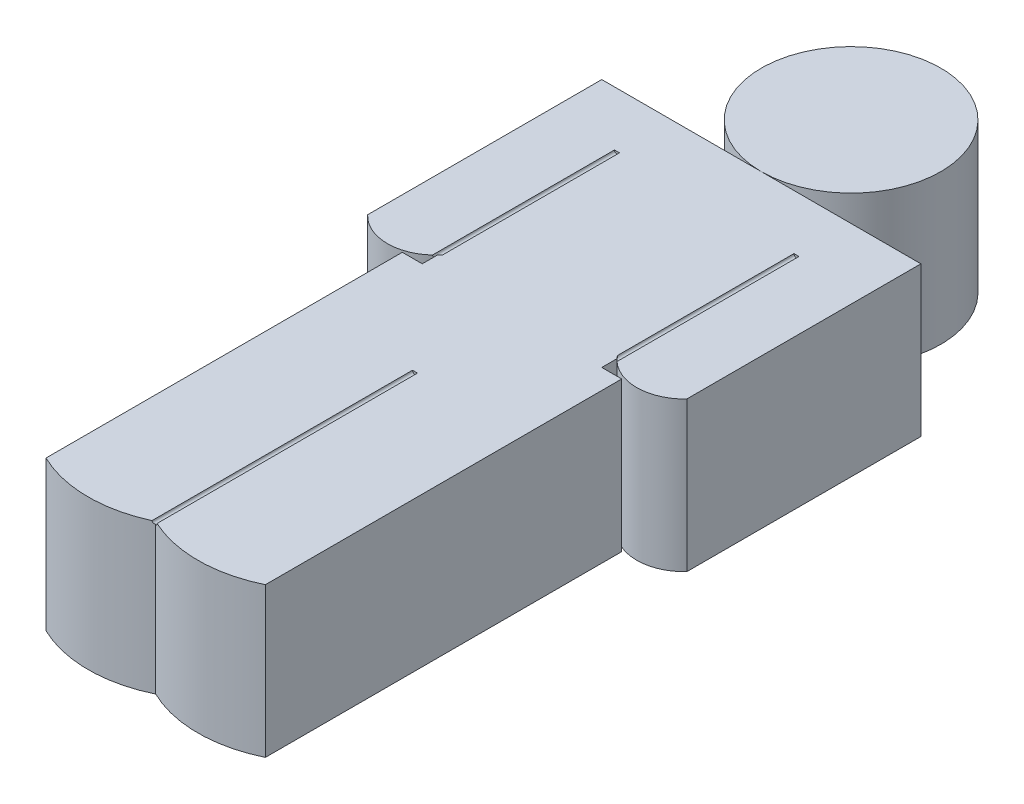
ISO-10303-21;
HEADER;
FILE_DESCRIPTION(('STEP AP214'),'2;1');
FILE_NAME('part.step','',(''),(''),'','','');
FILE_SCHEMA(('AUTOMOTIVE_DESIGN { 1 0 10303 214 1 1 1 1 }'));
ENDSEC;
DATA;
#1=APPLICATION_CONTEXT('core data for automotive mechanical design processes');
#2=APPLICATION_PROTOCOL_DEFINITION('international standard','automotive_design',2000,#1);
#3=PRODUCT_CONTEXT('',#1,'mechanical');
#4=PRODUCT('Part','Part','',(#3));
#5=PRODUCT_RELATED_PRODUCT_CATEGORY('part','',(#4));
#6=PRODUCT_DEFINITION_FORMATION('','',#4);
#7=PRODUCT_DEFINITION_CONTEXT('part definition',#1,'design');
#8=PRODUCT_DEFINITION('design','',#6,#7);
#9=PRODUCT_DEFINITION_SHAPE('','',#8);
#10=(LENGTH_UNIT() NAMED_UNIT(*) SI_UNIT(.MILLI.,.METRE.));
#11=(NAMED_UNIT(*) PLANE_ANGLE_UNIT() SI_UNIT($,.RADIAN.));
#12=(NAMED_UNIT(*) SI_UNIT($,.STERADIAN.) SOLID_ANGLE_UNIT());
#13=UNCERTAINTY_MEASURE_WITH_UNIT(LENGTH_MEASURE(1.E-05),#10,'distance_accuracy_value','');
#14=(GEOMETRIC_REPRESENTATION_CONTEXT(3) GLOBAL_UNCERTAINTY_ASSIGNED_CONTEXT((#13)) GLOBAL_UNIT_ASSIGNED_CONTEXT((#10,
#11,#12)) REPRESENTATION_CONTEXT('',''));
#15=CARTESIAN_POINT('',(0.,0.,0.));
#16=DIRECTION('',(0.,0.,1.));
#17=DIRECTION('',(1.,0.,0.));
#18=AXIS2_PLACEMENT_3D('',#15,#16,#17);
#19=CARTESIAN_POINT('',(0.,15.,-34.));
#20=DIRECTION('',(0.,-1.,0.));
#21=DIRECTION('',(0.,0.,-1.));
#22=AXIS2_PLACEMENT_3D('',#19,#20,#21);
#23=CYLINDRICAL_SURFACE('',#22,9.);
#24=CARTESIAN_POINT('',(0.,15.,-34.));
#25=DIRECTION('',(0.,1.,0.));
#26=DIRECTION('',(0.,0.,1.));
#27=AXIS2_PLACEMENT_3D('',#24,#25,#26);
#28=CIRCLE('',#27,9.);
#29=CARTESIAN_POINT('',(0.,15.,-25.));
#30=VERTEX_POINT('',#29);
#31=EDGE_CURVE('E12',#30,#30,#28,.T.);
#32=ORIENTED_EDGE('',*,*,#31,.F.);
#33=EDGE_LOOP('',(#32));
#34=FACE_BOUND('',#33,.T.);
#35=CARTESIAN_POINT('',(0.,0.,-34.));
#36=DIRECTION('',(0.,1.,0.));
#37=DIRECTION('',(0.,0.,1.));
#38=AXIS2_PLACEMENT_3D('',#35,#36,#37);
#39=CIRCLE('',#38,9.);
#40=CARTESIAN_POINT('',(0.,0.,-25.));
#41=VERTEX_POINT('',#40);
#42=EDGE_CURVE('E70',#41,#41,#39,.T.);
#43=ORIENTED_EDGE('',*,*,#42,.T.);
#44=EDGE_LOOP('',(#43));
#45=FACE_BOUND('',#44,.T.);
#46=ADVANCED_FACE('F67',(#34,#45),#23,.T.);
#47=CARTESIAN_POINT('',(0.,15.,0.));
#48=DIRECTION('',(0.,1.,0.));
#49=DIRECTION('',(0.,0.,1.));
#50=AXIS2_PLACEMENT_3D('',#47,#48,#49);
#51=PLANE('',#50);
#52=ORIENTED_EDGE('',*,*,#31,.T.);
#53=EDGE_LOOP('',(#52));
#54=FACE_BOUND('',#53,.T.);
#55=ADVANCED_FACE('F82',(#54),#51,.T.);
#56=CARTESIAN_POINT('',(0.,0.,0.));
#57=DIRECTION('',(0.,1.,0.));
#58=DIRECTION('',(0.,0.,1.));
#59=AXIS2_PLACEMENT_3D('',#56,#57,#58);
#60=PLANE('',#59);
#61=ORIENTED_EDGE('',*,*,#42,.F.);
#62=EDGE_LOOP('',(#61));
#63=FACE_BOUND('',#62,.T.);
#64=ADVANCED_FACE('F80',(#63),#60,.F.);
#65=CLOSED_SHELL('',(#46,#55,#64));
#66=MANIFOLD_SOLID_BREP('B2',#65);
#67=CARTESIAN_POINT('',(5.49999999999702,15.,24.4508474926195));
#68=DIRECTION('',(0.,-1.,0.));
#69=DIRECTION('',(0.,0.,-1.));
#70=AXIS2_PLACEMENT_3D('',#67,#68,#69);
#71=CYLINDRICAL_SURFACE('',#70,12.5491525073805);
#72=CARTESIAN_POINT('',(0.,14.75,35.7305296093073));
#73=CARTESIAN_POINT('',(0.0151917429758768,14.7499939525958,35.7379386432046));
#74=CARTESIAN_POINT('',(0.030408319613532,14.7513849473956,35.7453188273097));
#75=CARTESIAN_POINT('',(0.0604991903340054,14.7569486794015,35.7598408393742));
#76=CARTESIAN_POINT('',(0.0753722837928497,14.7611299841715,35.7669818618554));
#77=CARTESIAN_POINT('',(0.104311980644953,14.7722721522237,35.7808095200429));
#78=CARTESIAN_POINT('',(0.118377032446034,14.7792381712299,35.787495285848));
#79=CARTESIAN_POINT('',(0.145158683418947,14.7958513350814,35.8001700178912));
#80=CARTESIAN_POINT('',(0.157877064574848,14.8054948740658,35.8061599059977));
#81=CARTESIAN_POINT('',(0.180696752667213,14.8265801235266,35.8168666196132));
#82=CARTESIAN_POINT('',(0.190913274243636,14.8378678123865,35.8216402925644));
#83=CARTESIAN_POINT('',(0.209262562454438,14.8623667794742,35.8301896883421));
#84=CARTESIAN_POINT('',(0.217395751138456,14.8755776672412,35.8339656133012));
#85=CARTESIAN_POINT('',(0.230461146629122,14.9021014984492,35.8400193551582));
#86=CARTESIAN_POINT('',(0.235632487240922,14.9152714853539,35.8424093970391));
#87=CARTESIAN_POINT('',(0.243688748794359,14.9424219567888,35.8461290063904));
#88=CARTESIAN_POINT('',(0.246578559112484,14.9564006388364,35.8474608416633));
#89=CARTESIAN_POINT('',(0.248837921023468,14.9754207121644,35.8485018862791));
#90=CARTESIAN_POINT('',(0.249273701815418,14.9803281173357,35.848702644852));
#91=CARTESIAN_POINT('',(0.249854361094125,14.9901561723214,35.8489701254201));
#92=CARTESIAN_POINT('',(0.249999685992314,14.995076790154,35.8490370531047));
#93=CARTESIAN_POINT('',(0.250000000000001,15.,35.8490372021096));
#94=B_SPLINE_CURVE_WITH_KNOTS('',3,(#72,#73,#74,#75,#76,#77,#78,#79,#80,#81,#82,#83,#84,#85,#86,
#87,#88,#89,#90,#91,#92,#93),.UNSPECIFIED.,.F.,.F.,(4,2,2,2,2,2,2,2,2,2,4),(0.,
0.0506654136055286,0.101487114064062,0.152403346759942,0.203251339555192,0.250854477826768,
0.298447964829895,0.341270979800554,0.384001972974484,0.398786584367689,0.41354845526694),.UNSPECIFIED.);
#95=CARTESIAN_POINT('',(0.,14.75,35.7305296093073));
#96=VERTEX_POINT('',#95);
#97=CARTESIAN_POINT('',(0.249999999999999,15.,35.8490372021096));
#98=VERTEX_POINT('',#97);
#99=EDGE_CURVE('E245',#96,#98,#94,.T.);
#100=ORIENTED_EDGE('',*,*,#99,.F.);
#101=DIRECTION('',(0.,-1.,0.));
#102=VECTOR('',#101,1.);
#103=CARTESIAN_POINT('',(0.,15.,35.7305296093073));
#104=LINE('',#103,#102);
#105=CARTESIAN_POINT('',(0.,0.,35.7305296093073));
#106=VERTEX_POINT('',#105);
#107=EDGE_CURVE('E328',#96,#106,#104,.T.);
#108=ORIENTED_EDGE('',*,*,#107,.T.);
#109=CARTESIAN_POINT('',(5.49999999999702,0.,24.4508474926195));
#110=DIRECTION('',(0.,1.,0.));
#111=DIRECTION('',(0.,0.,1.));
#112=AXIS2_PLACEMENT_3D('',#109,#110,#111);
#113=CIRCLE('',#112,12.5491525073805);
#114=CARTESIAN_POINT('',(11.,0.,35.7305296093044));
#115=VERTEX_POINT('',#114);
#116=EDGE_CURVE('E377',#115,#106,#113,.F.);
#117=ORIENTED_EDGE('',*,*,#116,.F.);
#118=DIRECTION('',(0.,-1.,0.));
#119=VECTOR('',#118,1.);
#120=CARTESIAN_POINT('',(11.,15.,35.7305296093044));
#121=LINE('',#120,#119);
#122=CARTESIAN_POINT('',(11.,15.,35.7305296093044));
#123=VERTEX_POINT('',#122);
#124=EDGE_CURVE('E288',#123,#115,#121,.T.);
#125=ORIENTED_EDGE('',*,*,#124,.F.);
#126=CARTESIAN_POINT('',(5.49999999999702,15.,24.4508474926195));
#127=DIRECTION('',(0.,1.,0.));
#128=DIRECTION('',(0.,0.,1.));
#129=AXIS2_PLACEMENT_3D('',#126,#127,#128);
#130=CIRCLE('',#129,12.5491525073805);
#131=EDGE_CURVE('E336',#123,#98,#130,.F.);
#132=ORIENTED_EDGE('',*,*,#131,.T.);
#133=EDGE_LOOP('',(#100,#108,#117,#125,#132));
#134=FACE_BOUND('',#133,.T.);
#135=ADVANCED_FACE('F108',(#134),#71,.T.);
#136=CARTESIAN_POINT('',(11.,15.,0.));
#137=DIRECTION('',(-1.,0.,0.));
#138=DIRECTION('',(0.,0.,1.));
#139=AXIS2_PLACEMENT_3D('',#136,#137,#138);
#140=PLANE('',#139);
#141=DIRECTION('',(0.,0.,-1.));
#142=VECTOR('',#141,1.);
#143=CARTESIAN_POINT('',(11.,0.,0.));
#144=LINE('',#143,#142);
#145=CARTESIAN_POINT('',(11.,0.,0.));
#146=VERTEX_POINT('',#145);
#147=EDGE_CURVE('E373',#115,#146,#144,.T.);
#148=ORIENTED_EDGE('',*,*,#147,.T.);
#149=DIRECTION('',(0.,-1.,0.));
#150=VECTOR('',#149,1.);
#151=CARTESIAN_POINT('',(11.,15.,0.));
#152=LINE('',#151,#150);
#153=CARTESIAN_POINT('',(11.,15.,0.));
#154=VERTEX_POINT('',#153);
#155=EDGE_CURVE('E291',#154,#146,#152,.T.);
#156=ORIENTED_EDGE('',*,*,#155,.F.);
#157=DIRECTION('',(0.,0.,-1.));
#158=VECTOR('',#157,1.);
#159=CARTESIAN_POINT('',(11.,15.,0.));
#160=LINE('',#159,#158);
#161=EDGE_CURVE('E419',#123,#154,#160,.T.);
#162=ORIENTED_EDGE('',*,*,#161,.F.);
#163=ORIENTED_EDGE('',*,*,#124,.T.);
#164=EDGE_LOOP('',(#148,#156,#162,#163));
#165=FACE_BOUND('',#164,.T.);
#166=ADVANCED_FACE('F580',(#165),#140,.F.);
#167=CARTESIAN_POINT('',(0.,15.,0.));
#168=DIRECTION('',(0.,0.,-1.));
#169=DIRECTION('',(-1.,0.,0.));
#170=AXIS2_PLACEMENT_3D('',#167,#168,#169);
#171=PLANE('',#170);
#172=DIRECTION('',(1.,0.,0.));
#173=VECTOR('',#172,1.);
#174=CARTESIAN_POINT('',(0.,0.,0.));
#175=LINE('',#174,#173);
#176=CARTESIAN_POINT('',(9.,0.,0.));
#177=VERTEX_POINT('',#176);
#178=EDGE_CURVE('E369',#177,#146,#175,.T.);
#179=ORIENTED_EDGE('',*,*,#178,.F.);
#180=DIRECTION('',(0.,-1.,0.));
#181=VECTOR('',#180,1.);
#182=CARTESIAN_POINT('',(9.,15.,0.));
#183=LINE('',#182,#181);
#184=CARTESIAN_POINT('',(9.,15.,0.));
#185=VERTEX_POINT('',#184);
#186=EDGE_CURVE('E294',#185,#177,#183,.T.);
#187=ORIENTED_EDGE('',*,*,#186,.F.);
#188=DIRECTION('',(1.,0.,0.));
#189=VECTOR('',#188,1.);
#190=CARTESIAN_POINT('',(0.,15.,0.));
#191=LINE('',#190,#189);
#192=EDGE_CURVE('E415',#185,#154,#191,.T.);
#193=ORIENTED_EDGE('',*,*,#192,.T.);
#194=ORIENTED_EDGE('',*,*,#155,.T.);
#195=EDGE_LOOP('',(#179,#187,#193,#194));
#196=FACE_BOUND('',#195,.T.);
#197=ADVANCED_FACE('F536',(#196),#171,.T.);
#198=CARTESIAN_POINT('',(9.,15.,0.));
#199=DIRECTION('',(1.,0.,0.));
#200=DIRECTION('',(0.,0.,-1.));
#201=AXIS2_PLACEMENT_3D('',#198,#199,#200);
#202=PLANE('',#201);
#203=DIRECTION('',(0.,0.,1.));
#204=VECTOR('',#203,1.);
#205=CARTESIAN_POINT('',(9.,0.,0.));
#206=LINE('',#205,#204);
#207=CARTESIAN_POINT('',(9.,0.,-1.52426410276974));
#208=VERTEX_POINT('',#207);
#209=EDGE_CURVE('E365',#208,#177,#206,.T.);
#210=ORIENTED_EDGE('',*,*,#209,.F.);
#211=DIRECTION('',(0.,-1.,0.));
#212=VECTOR('',#211,1.);
#213=CARTESIAN_POINT('',(9.,15.,-1.52426410276974));
#214=LINE('',#213,#212);
#215=CARTESIAN_POINT('',(9.,14.75,-1.52426410276973));
#216=VERTEX_POINT('',#215);
#217=EDGE_CURVE('E300',#216,#208,#214,.T.);
#218=ORIENTED_EDGE('',*,*,#217,.F.);
#219=CARTESIAN_POINT('',(9.,15.,-1.52426410276974));
#220=VERTEX_POINT('',#219);
#221=EDGE_CURVE('E297',#220,#216,#214,.T.);
#222=ORIENTED_EDGE('',*,*,#221,.F.);
#223=DIRECTION('',(0.,0.,1.));
#224=VECTOR('',#223,1.);
#225=CARTESIAN_POINT('',(9.,15.,0.));
#226=LINE('',#225,#224);
#227=EDGE_CURVE('E411',#220,#185,#226,.T.);
#228=ORIENTED_EDGE('',*,*,#227,.T.);
#229=ORIENTED_EDGE('',*,*,#186,.T.);
#230=EDGE_LOOP('',(#210,#218,#222,#228,#229));
#231=FACE_BOUND('',#230,.T.);
#232=ADVANCED_FACE('F515',(#231),#202,.T.);
#233=CARTESIAN_POINT('',(12.5,15.,-4.79258417500001));
#234=DIRECTION('',(0.,-1.,0.));
#235=DIRECTION('',(0.,0.,-1.));
#236=AXIS2_PLACEMENT_3D('',#233,#234,#235);
#237=CYLINDRICAL_SURFACE('',#236,4.78872802469959);
#238=CARTESIAN_POINT('',(8.75,15.,-1.81442768237856));
#239=CARTESIAN_POINT('',(8.74999990332047,15.0104739874074,-1.81442780927218));
#240=CARTESIAN_POINT('',(8.75066482224969,15.0209474979495,-1.81358999016842));
#241=CARTESIAN_POINT('',(8.75324883459207,15.0414891966629,-1.81034074338826));
#242=CARTESIAN_POINT('',(8.7551693280895,15.0515569190212,-1.80792755903517));
#243=CARTESIAN_POINT('',(8.76005657513711,15.0708933967919,-1.8018059862385));
#244=CARTESIAN_POINT('',(8.76301306882711,15.0801689161113,-1.7981103021739));
#245=CARTESIAN_POINT('',(8.76977084851299,15.0979016661262,-1.78969626506693));
#246=CARTESIAN_POINT('',(8.77357251049626,15.1063585302179,-1.7849774568937));
#247=CARTESIAN_POINT('',(8.7841045892428,15.1268260147668,-1.77196508657687));
#248=CARTESIAN_POINT('',(8.79129959459044,15.1382504072605,-1.76312797781356));
#249=CARTESIAN_POINT('',(8.806799373211,15.1591980139258,-1.7442508483017));
#250=CARTESIAN_POINT('',(8.81510728301793,15.1687156577968,-1.73420743637821));
#251=CARTESIAN_POINT('',(8.8369921032231,15.1904573274968,-1.70799195343098));
#252=CARTESIAN_POINT('',(8.85108356998664,15.2015605217709,-1.69132163325249));
#253=CARTESIAN_POINT('',(8.88043821116125,15.2202444636492,-1.6571096879956));
#254=CARTESIAN_POINT('',(8.89570231715257,15.2278223762307,-1.63956737416631));
#255=CARTESIAN_POINT('',(8.92765910132049,15.2399374238356,-1.60339916007521));
#256=CARTESIAN_POINT('',(8.94438443051636,15.2443419920491,-1.5847578815977));
#257=CARTESIAN_POINT('',(8.97839743148258,15.2496593836323,-1.54745395154867));
#258=CARTESIAN_POINT('',(8.99568578771742,15.2505677838029,-1.52879130276376));
#259=CARTESIAN_POINT('',(9.03389947566316,15.2485681661792,-1.48819563966653));
#260=CARTESIAN_POINT('',(9.05487271594316,15.2448761861554,-1.46633959445014));
#261=CARTESIAN_POINT('',(9.09632795756342,15.2317141695525,-1.42393426668173));
#262=CARTESIAN_POINT('',(9.11681130843986,15.2222625361979,-1.40338105131828));
#263=CARTESIAN_POINT('',(9.14704936391844,15.2025793122635,-1.37353936022687));
#264=CARTESIAN_POINT('',(9.15745122668942,15.1946519777231,-1.36337463804434));
#265=CARTESIAN_POINT('',(9.17736525599253,15.176694119747,-1.34407657147858));
#266=CARTESIAN_POINT('',(9.18687876346094,15.1666668427936,-1.33494166815867));
#267=CARTESIAN_POINT('',(9.20280258673648,15.1466321800833,-1.31976081527466));
#268=CARTESIAN_POINT('',(9.20945484361373,15.1370111051606,-1.31346099915655));
#269=CARTESIAN_POINT('',(9.2215675552168,15.1164049415985,-1.3020446865614));
#270=CARTESIAN_POINT('',(9.22702932422192,15.1054213783685,-1.29692688478363));
#271=CARTESIAN_POINT('',(9.23563071252569,15.0841833517316,-1.28889495238291));
#272=CARTESIAN_POINT('',(9.2390051436535,15.0741096046897,-1.28575619762943));
#273=CARTESIAN_POINT('',(9.24448090694747,15.0533315156181,-1.28067221377321));
#274=CARTESIAN_POINT('',(9.24658296172704,15.0426275353108,-1.27872630721505));
#275=CARTESIAN_POINT('',(9.24937314887101,15.020835349177,-1.27614493212539));
#276=CARTESIAN_POINT('',(9.25005575314608,15.0097458115029,-1.27551458704993));
#277=CARTESIAN_POINT('',(9.24993710380035,14.9875815480756,-1.27562422631091));
#278=CARTESIAN_POINT('',(9.24913592828095,14.9765068215735,-1.27636413852141));
#279=CARTESIAN_POINT('',(9.2462096467683,14.955425356253,-1.27907198074358));
#280=CARTESIAN_POINT('',(9.24417216248223,14.9453955331904,-1.28095864992135));
#281=CARTESIAN_POINT('',(9.23897856421033,14.9258979194856,-1.28578110620704));
#282=CARTESIAN_POINT('',(9.23582228561131,14.9164302117894,-1.28871704769958));
#283=CARTESIAN_POINT('',(9.22829270774757,14.8975650102122,-1.29574621929804));
#284=CARTESIAN_POINT('',(9.22384808796584,14.8882217599051,-1.2999076093415));
#285=CARTESIAN_POINT('',(9.21407340139216,14.8704801476626,-1.3091020556399));
#286=CARTESIAN_POINT('',(9.2087427929695,14.862082369022,-1.31413564517639));
#287=CARTESIAN_POINT('',(9.19441886752458,14.8421364832497,-1.32773347301977));
#288=CARTESIAN_POINT('',(9.18496735005637,14.831235787386,-1.33676802426058));
#289=CARTESIAN_POINT('',(9.16501079709491,14.8116713674786,-1.35602238040718));
#290=CARTESIAN_POINT('',(9.15450333359509,14.8030129705757,-1.36624492578863));
#291=CARTESIAN_POINT('',(9.12879001200552,14.7849562295196,-1.39151198756653));
#292=CARTESIAN_POINT('',(9.11329652151448,14.7764919298026,-1.40693018853477));
#293=CARTESIAN_POINT('',(9.08179940561578,14.7631412814075,-1.43873187801351));
#294=CARTESIAN_POINT('',(9.06579524181478,14.7582588484461,-1.45511640184402));
#295=CARTESIAN_POINT('',(9.02940519688609,14.7508681836735,-1.49292570482442));
#296=CARTESIAN_POINT('',(9.00899662735778,14.7493494419057,-1.51452257167594));
#297=CARTESIAN_POINT('',(8.96865284940244,14.751150350974,-1.55802284135528));
#298=CARTESIAN_POINT('',(8.94871885176707,14.7544812584812,-1.5799268401006));
#299=CARTESIAN_POINT('',(8.90970855613067,14.7659801668951,-1.62357986388089));
#300=CARTESIAN_POINT('',(8.89064103619248,14.7741892316147,-1.64532596817208));
#301=CARTESIAN_POINT('',(8.85421608770099,14.7958083084484,-1.68759747948562));
#302=CARTESIAN_POINT('',(8.83685110459897,14.8091939073102,-1.70812810245218));
#303=CARTESIAN_POINT('',(8.81340657634525,14.8332741763335,-1.73626518310007));
#304=CARTESIAN_POINT('',(8.80622143648532,14.8416384745103,-1.74495704786589));
#305=CARTESIAN_POINT('',(8.79268742770785,14.8598219121645,-1.76143557170882));
#306=CARTESIAN_POINT('',(8.78633758801675,14.869639334119,-1.76922328032396));
#307=CARTESIAN_POINT('',(8.77586042213823,14.8888352707277,-1.78214289900115));
#308=CARTESIAN_POINT('',(8.77153943771584,14.8979546399358,-1.78749927765731));
#309=CARTESIAN_POINT('',(8.76388721909108,14.9171897153465,-1.79701834240602));
#310=CARTESIAN_POINT('',(8.76055512316242,14.9273045437996,-1.80118206767652));
#311=CARTESIAN_POINT('',(8.75532485400337,14.9476821040242,-1.8077322799188));
#312=CARTESIAN_POINT('',(8.75334699624328,14.9578916671088,-1.81021738435055));
#313=CARTESIAN_POINT('',(8.75068548004902,14.9787347064984,-1.81356394007555));
#314=CARTESIAN_POINT('',(8.75000009814176,14.9893675989488,-1.81442755356574));
#315=CARTESIAN_POINT('',(8.75,15.,-1.81442768237856));
#316=B_SPLINE_CURVE_WITH_KNOTS('',3,(#238,#239,#240,#241,#242,#243,#244,#245,#246,#247,#248,
#249,#250,#251,#252,#253,#254,#255,#256,#257,#258,#259,#260,#261,#262,#263,#264,#265,#266,#267,
#268,#269,#270,#271,#272,#273,#274,#275,#276,#277,#278,#279,#280,#281,#282,#283,#284,#285,#286,
#287,#288,#289,#290,#291,#292,#293,#294,#295,#296,#297,#298,#299,#300,#301,#302,#303,#304,#305,
#306,#307,#308,#309,#310,#311,#312,#313,#314,#315),.UNSPECIFIED.,.T.,.F.,(4,2,2,2,2,2,2,2,2,2,2,
2,2,2,2,2,2,2,2,2,2,2,2,2,2,2,2,2,2,2,2,2,2,2,2,2,2,2,4),(0.,0.0313705622509901,
0.0627761654447175,0.0938791507490141,0.12499600052868,0.173132471976601,0.221407580095592,
0.294478272332121,0.367607626682899,0.443638298321145,0.519765129082803,0.610831923771543,
0.701609256812368,0.751154073166558,0.800622851992999,0.840332689226262,0.87999846287285,
0.913092188663836,0.946167102047561,0.979370587180347,1.01257232463783,1.04365826359723,
1.074748778269,1.10808014204461,1.14143195771201,1.19221490935571,1.24311742414751,
1.31305466444043,1.38306824704651,1.47188091740702,1.56090006253748,1.65067939324778,
1.74004037656132,1.78206686558115,1.82404407219857,1.85819865871009,1.89232339462452,
1.92421097157077,1.9560559973552),.UNSPECIFIED.);
#317=CARTESIAN_POINT('',(9.25,15.,-1.27556610644487));
#318=VERTEX_POINT('',#317);
#319=EDGE_CURVE('E493',#318,#216,#316,.T.);
#320=ORIENTED_EDGE('',*,*,#319,.T.);
#321=ORIENTED_EDGE('',*,*,#217,.T.);
#322=CARTESIAN_POINT('',(12.5,0.,-4.79258417500001));
#323=DIRECTION('',(0.,1.,0.));
#324=DIRECTION('',(0.,0.,1.));
#325=AXIS2_PLACEMENT_3D('',#322,#323,#324);
#326=CIRCLE('',#325,4.78872802469959);
#327=CARTESIAN_POINT('',(16.,0.,-1.52426410276973));
#328=VERTEX_POINT('',#327);
#329=EDGE_CURVE('E361',#328,#208,#326,.F.);
#330=ORIENTED_EDGE('',*,*,#329,.F.);
#331=DIRECTION('',(0.,-1.,0.));
#332=VECTOR('',#331,1.);
#333=CARTESIAN_POINT('',(16.,15.,-1.52426410276973));
#334=LINE('',#333,#332);
#335=CARTESIAN_POINT('',(16.,15.,-1.52426410276973));
#336=VERTEX_POINT('',#335);
#337=EDGE_CURVE('E301',#336,#328,#334,.T.);
#338=ORIENTED_EDGE('',*,*,#337,.F.);
#339=CARTESIAN_POINT('',(12.5,15.,-4.79258417500001));
#340=DIRECTION('',(0.,1.,0.));
#341=DIRECTION('',(0.,0.,1.));
#342=AXIS2_PLACEMENT_3D('',#339,#340,#341);
#343=CIRCLE('',#342,4.78872802469959);
#344=EDGE_CURVE('E407',#336,#318,#343,.F.);
#345=ORIENTED_EDGE('',*,*,#344,.T.);
#346=EDGE_LOOP('',(#320,#321,#330,#338,#345));
#347=FACE_BOUND('',#346,.T.);
#348=ADVANCED_FACE('F512',(#347),#237,.T.);
#349=CARTESIAN_POINT('',(16.,15.,0.));
#350=DIRECTION('',(1.,0.,0.));
#351=DIRECTION('',(0.,0.,-1.));
#352=AXIS2_PLACEMENT_3D('',#349,#350,#351);
#353=PLANE('',#352);
#354=DIRECTION('',(0.,0.,1.));
#355=VECTOR('',#354,1.);
#356=CARTESIAN_POINT('',(16.,0.,0.));
#357=LINE('',#356,#355);
#358=CARTESIAN_POINT('',(16.,0.,-25.));
#359=VERTEX_POINT('',#358);
#360=EDGE_CURVE('E357',#359,#328,#357,.T.);
#361=ORIENTED_EDGE('',*,*,#360,.F.);
#362=DIRECTION('',(0.,-1.,0.));
#363=VECTOR('',#362,1.);
#364=CARTESIAN_POINT('',(16.,15.,-25.));
#365=LINE('',#364,#363);
#366=CARTESIAN_POINT('',(16.,15.,-25.));
#367=VERTEX_POINT('',#366);
#368=EDGE_CURVE('E304',#367,#359,#365,.T.);
#369=ORIENTED_EDGE('',*,*,#368,.F.);
#370=DIRECTION('',(0.,0.,1.));
#371=VECTOR('',#370,1.);
#372=CARTESIAN_POINT('',(16.,15.,0.));
#373=LINE('',#372,#371);
#374=EDGE_CURVE('E403',#367,#336,#373,.T.);
#375=ORIENTED_EDGE('',*,*,#374,.T.);
#376=ORIENTED_EDGE('',*,*,#337,.T.);
#377=EDGE_LOOP('',(#361,#369,#375,#376));
#378=FACE_BOUND('',#377,.T.);
#379=ADVANCED_FACE('F521',(#378),#353,.T.);
#380=CARTESIAN_POINT('',(0.,15.,-25.));
#381=DIRECTION('',(0.,0.,-1.));
#382=DIRECTION('',(-1.,0.,0.));
#383=AXIS2_PLACEMENT_3D('',#380,#381,#382);
#384=PLANE('',#383);
#385=DIRECTION('',(1.,0.,0.));
#386=VECTOR('',#385,1.);
#387=CARTESIAN_POINT('',(0.,0.,-25.));
#388=LINE('',#387,#386);
#389=CARTESIAN_POINT('',(-16.,0.,-25.));
#390=VERTEX_POINT('',#389);
#391=EDGE_CURVE('E353',#390,#359,#388,.T.);
#392=ORIENTED_EDGE('',*,*,#391,.F.);
#393=DIRECTION('',(0.,-1.,0.));
#394=VECTOR('',#393,1.);
#395=CARTESIAN_POINT('',(-16.,15.,-25.));
#396=LINE('',#395,#394);
#397=CARTESIAN_POINT('',(-16.,15.,-25.));
#398=VERTEX_POINT('',#397);
#399=EDGE_CURVE('E307',#398,#390,#396,.T.);
#400=ORIENTED_EDGE('',*,*,#399,.F.);
#401=DIRECTION('',(1.,0.,0.));
#402=VECTOR('',#401,1.);
#403=CARTESIAN_POINT('',(0.,15.,-25.));
#404=LINE('',#403,#402);
#405=EDGE_CURVE('E399',#398,#367,#404,.T.);
#406=ORIENTED_EDGE('',*,*,#405,.T.);
#407=ORIENTED_EDGE('',*,*,#368,.T.);
#408=EDGE_LOOP('',(#392,#400,#406,#407));
#409=FACE_BOUND('',#408,.T.);
#410=ADVANCED_FACE('F567',(#409),#384,.T.);
#411=CARTESIAN_POINT('',(-16.,15.,0.));
#412=DIRECTION('',(1.,0.,0.));
#413=DIRECTION('',(0.,0.,-1.));
#414=AXIS2_PLACEMENT_3D('',#411,#412,#413);
#415=PLANE('',#414);
#416=DIRECTION('',(0.,0.,1.));
#417=VECTOR('',#416,1.);
#418=CARTESIAN_POINT('',(-16.,0.,0.));
#419=LINE('',#418,#417);
#420=CARTESIAN_POINT('',(-16.,0.,-1.52426410276973));
#421=VERTEX_POINT('',#420);
#422=EDGE_CURVE('E350',#390,#421,#419,.T.);
#423=ORIENTED_EDGE('',*,*,#422,.T.);
#424=DIRECTION('',(0.,-1.,0.));
#425=VECTOR('',#424,1.);
#426=CARTESIAN_POINT('',(-16.,15.,-1.52426410276973));
#427=LINE('',#426,#425);
#428=CARTESIAN_POINT('',(-16.,15.,-1.52426410276973));
#429=VERTEX_POINT('',#428);
#430=EDGE_CURVE('E310',#429,#421,#427,.T.);
#431=ORIENTED_EDGE('',*,*,#430,.F.);
#432=DIRECTION('',(0.,0.,1.));
#433=VECTOR('',#432,1.);
#434=CARTESIAN_POINT('',(-16.,15.,0.));
#435=LINE('',#434,#433);
#436=EDGE_CURVE('E396',#398,#429,#435,.T.);
#437=ORIENTED_EDGE('',*,*,#436,.F.);
#438=ORIENTED_EDGE('',*,*,#399,.T.);
#439=EDGE_LOOP('',(#423,#431,#437,#438));
#440=FACE_BOUND('',#439,.T.);
#441=ADVANCED_FACE('F565',(#440),#415,.F.);
#442=CARTESIAN_POINT('',(-12.5,15.,-4.79258417500001));
#443=DIRECTION('',(0.,-1.,0.));
#444=DIRECTION('',(0.,0.,-1.));
#445=AXIS2_PLACEMENT_3D('',#442,#443,#444);
#446=CYLINDRICAL_SURFACE('',#445,4.78872802469959);
#447=DIRECTION('',(0.,-1.,0.));
#448=VECTOR('',#447,1.);
#449=CARTESIAN_POINT('',(-9.,15.,-1.52426410276974));
#450=LINE('',#449,#448);
#451=CARTESIAN_POINT('',(-8.99999999999972,14.7499999999987,-1.52426410276983));
#452=VERTEX_POINT('',#451);
#453=CARTESIAN_POINT('',(-9.,0.,-1.52426410276974));
#454=VERTEX_POINT('',#453);
#455=EDGE_CURVE('E318',#452,#454,#450,.T.);
#456=ORIENTED_EDGE('',*,*,#455,.F.);
#457=CARTESIAN_POINT('',(-9.25,15.,-1.27556610644487));
#458=CARTESIAN_POINT('',(-9.24999851968618,14.9886823686843,-1.27556738574032));
#459=CARTESIAN_POINT('',(-9.24922396265844,14.9773430073407,-1.27628272925402));
#460=CARTESIAN_POINT('',(-9.24618091136241,14.9550255271195,-1.27909852361628));
#461=CARTESIAN_POINT('',(-9.24390799040373,14.9440485801565,-1.28120307870556));
#462=CARTESIAN_POINT('',(-9.23805218808987,14.9228559961321,-1.28664232968801));
#463=CARTESIAN_POINT('',(-9.23447775908447,14.9126359476638,-1.2899690894735));
#464=CARTESIAN_POINT('',(-9.22623479521513,14.8930860498205,-1.29767226301955));
#465=CARTESIAN_POINT('',(-9.2215663903315,14.8837560948747,-1.30204855208215));
#466=CARTESIAN_POINT('',(-9.20952534932791,14.8629196997304,-1.31339135598322));
#467=CARTESIAN_POINT('',(-9.20178250434226,14.85182690037,-1.32072464235515));
#468=CARTESIAN_POINT('',(-9.18515961019282,14.8315095515405,-1.3365919637949));
#469=CARTESIAN_POINT('',(-9.17627732467104,14.8222887707044,-1.34512836353092));
#470=CARTESIAN_POINT('',(-9.15436234125178,14.8026137164656,-1.36637151096979));
#471=CARTESIAN_POINT('',(-9.14100002766186,14.7929422245432,-1.3794614577633));
#472=CARTESIAN_POINT('',(-9.11352997337554,14.7766922561141,-1.40671440220144));
#473=CARTESIAN_POINT('',(-9.09942115100808,14.7701184125494,-1.42087897058391));
#474=CARTESIAN_POINT('',(-9.06612763917143,14.7580560595414,-1.45474501096124));
#475=CARTESIAN_POINT('',(-9.0468208563501,14.7536625498754,-1.47471627763968));
#476=CARTESIAN_POINT('',(-9.00832489860711,14.7493878077948,-1.51525200697778));
#477=CARTESIAN_POINT('',(-8.98913592761127,14.7495129389262,-1.53581726544897));
#478=CARTESIAN_POINT('',(-8.95105825562888,14.7540765864765,-1.57734935338504));
#479=CARTESIAN_POINT('',(-8.93217912674868,14.7585834012594,-1.59831738346317));
#480=CARTESIAN_POINT('',(-8.89550575738467,14.7720473396255,-1.6397602731789));
#481=CARTESIAN_POINT('',(-8.87770987087485,14.7809975117418,-1.66023585094462));
#482=CARTESIAN_POINT('',(-8.84980148047346,14.799714649744,-1.69286581550497));
#483=CARTESIAN_POINT('',(-8.83919403978189,14.8080783522676,-1.70540643099539));
#484=CARTESIAN_POINT('',(-8.81895580923965,14.8270401943449,-1.72956673949288));
#485=CARTESIAN_POINT('',(-8.80932359167462,14.8376349954521,-1.7411877731439));
#486=CARTESIAN_POINT('',(-8.79401664051189,14.8579328100449,-1.75981227340459));
#487=CARTESIAN_POINT('',(-8.78799609643372,14.8670304433578,-1.7671882266661));
#488=CARTESIAN_POINT('',(-8.7769311799524,14.886572059867,-1.78081539357623));
#489=CARTESIAN_POINT('',(-8.77188525103142,14.8970138511573,-1.78706839949713));
#490=CARTESIAN_POINT('',(-8.76416890881461,14.9165389839714,-1.79666849655124));
#491=CARTESIAN_POINT('',(-8.76121905514827,14.9253441508458,-1.80035275866217));
#492=CARTESIAN_POINT('',(-8.75625977386051,14.9436088346822,-1.80655988388473));
#493=CARTESIAN_POINT('',(-8.7542494743709,14.9530677356099,-1.80908382369269));
#494=CARTESIAN_POINT('',(-8.75132167774598,14.9725002974294,-1.81276325152993));
#495=CARTESIAN_POINT('',(-8.75041296740119,14.9824774437456,-1.81390773596889));
#496=CARTESIAN_POINT('',(-8.74981199196044,15.0025255941681,-1.81466437719283));
#497=CARTESIAN_POINT('',(-8.7501192425169,15.0125965593095,-1.81427714409916));
#498=CARTESIAN_POINT('',(-8.75180842467271,15.0312812559375,-1.81215176139634));
#499=CARTESIAN_POINT('',(-8.75305941308126,15.039926830804,-1.81057822654072));
#500=CARTESIAN_POINT('',(-8.75638547061628,15.05679792281,-1.80640376345067));
#501=CARTESIAN_POINT('',(-8.75846091031062,15.0650232491808,-1.80380237322672));
#502=CARTESIAN_POINT('',(-8.76424366150965,15.0839706295966,-1.79657529628239));
#503=CARTESIAN_POINT('',(-8.76827151655657,15.0944440607698,-1.79155591396351));
#504=CARTESIAN_POINT('',(-8.77735273369021,15.1142247687915,-1.78029832808188));
#505=CARTESIAN_POINT('',(-8.78240834313162,15.1235294164958,-1.77405745465967));
#506=CARTESIAN_POINT('',(-8.79590399738827,15.1451787226695,-1.7574976929806));
#507=CARTESIAN_POINT('',(-8.80480330424587,15.1568369732839,-1.74665984679558));
#508=CARTESIAN_POINT('',(-8.82374006787143,15.177856881075,-1.7238301328214));
#509=CARTESIAN_POINT('',(-8.8337798919594,15.1872136289312,-1.71183587281552));
#510=CARTESIAN_POINT('',(-8.85966910886776,15.2078403076731,-1.68123796207986));
#511=CARTESIAN_POINT('',(-8.87600076272939,15.2178854372863,-1.66221651091805));
#512=CARTESIAN_POINT('',(-8.90980268592262,15.2339107980858,-1.62350483897246));
#513=CARTESIAN_POINT('',(-8.92727428531252,15.2398861843869,-1.60381385029084));
#514=CARTESIAN_POINT('',(-8.96343733679971,15.2480239445733,-1.56374718480141));
#515=CARTESIAN_POINT('',(-8.98214913496965,15.2500767327298,-1.54336759052932));
#516=CARTESIAN_POINT('',(-9.01991577281205,15.2499190039152,-1.50295003276895));
#517=CARTESIAN_POINT('',(-9.03897032333259,15.2477119275942,-1.48291180674813));
#518=CARTESIAN_POINT('',(-9.07324030852481,15.2395486340435,-1.44748016062729));
#519=CARTESIAN_POINT('',(-9.08848928753057,15.2343951164385,-1.43193462611611));
#520=CARTESIAN_POINT('',(-9.11844854640503,15.2207715938409,-1.40179159688707));
#521=CARTESIAN_POINT('',(-9.13315954679449,15.2123062167199,-1.3871928122571));
#522=CARTESIAN_POINT('',(-9.15756536678069,15.1945126169197,-1.36326121784689));
#523=CARTESIAN_POINT('',(-9.16753777826048,15.1860425123106,-1.35357473375888));
#524=CARTESIAN_POINT('',(-9.18648812382566,15.1670377368014,-1.33531254080977));
#525=CARTESIAN_POINT('',(-9.1954676471302,15.1565064421589,-1.32673505304814));
#526=CARTESIAN_POINT('',(-9.21014282120406,15.1358798920655,-1.31280900043245));
#527=CARTESIAN_POINT('',(-9.21612736663899,15.1261916860457,-1.30716436676262));
#528=CARTESIAN_POINT('',(-9.22690301689903,15.1055928673233,-1.2970431734552));
#529=CARTESIAN_POINT('',(-9.23169383385557,15.0946819606833,-1.29256689555516));
#530=CARTESIAN_POINT('',(-9.23980356225608,15.0717218291837,-1.28501141652738));
#531=CARTESIAN_POINT('',(-9.24310667091561,15.0596619593998,-1.28194720714624));
#532=CARTESIAN_POINT('',(-9.24786898079183,15.0349050487445,-1.27753495409737));
#533=CARTESIAN_POINT('',(-9.24933538210045,15.0222107000518,-1.27618020898807));
#534=CARTESIAN_POINT('',(-9.24994051976271,15.0063203650321,-1.27562109545029));
#535=CARTESIAN_POINT('',(-9.2500004134537,15.0031610300878,-1.27556574913588));
#536=CARTESIAN_POINT('',(-9.25,15.,-1.27556610644487));
#537=B_SPLINE_CURVE_WITH_KNOTS('',3,(#457,#458,#459,#460,#461,#462,#463,#464,#465,#466,#467,
#468,#469,#470,#471,#472,#473,#474,#475,#476,#477,#478,#479,#480,#481,#482,#483,#484,#485,#486,
#487,#488,#489,#490,#491,#492,#493,#494,#495,#496,#497,#498,#499,#500,#501,#502,#503,#504,#505,
#506,#507,#508,#509,#510,#511,#512,#513,#514,#515,#516,#517,#518,#519,#520,#521,#522,#523,#524,
#525,#526,#527,#528,#529,#530,#531,#532,#533,#534,#535,#536),.UNSPECIFIED.,.T.,.F.,(4,2,2,2,2,2,
2,2,2,2,2,2,2,2,2,2,2,2,2,2,2,2,2,2,2,2,2,2,2,2,2,2,2,2,2,2,2,2,2,4),(0.,0.0339434685886047,
0.067987670173533,0.101814611665594,0.135637536058899,0.181546944804772,0.227547878599248,
0.290377319948855,0.353300435074904,0.437230062546093,0.521277891676892,0.606657150316688,
0.691903255229762,0.747061509375966,0.802137808014538,0.841528313073275,0.880855379357593,
0.910714354392748,0.940545566224308,0.970613192365811,1.00066884302709,1.02718178696244,
1.05370666123523,1.09037872920097,1.12713186633073,1.18153786933808,1.23605893815205,
1.31665220552644,1.39734124941118,1.48025331353848,1.5630984384435,1.63001021684081,
1.69682882721707,1.74550797786673,1.79410804883971,1.83209441520371,1.87008993316312,
1.90848004339183,1.94671918436388,1.95619964211148),.UNSPECIFIED.);
#538=CARTESIAN_POINT('',(-9.25,15.,-1.27556610644487));
#539=VERTEX_POINT('',#538);
#540=EDGE_CURVE('E381',#539,#452,#537,.T.);
#541=ORIENTED_EDGE('',*,*,#540,.F.);
#542=CARTESIAN_POINT('',(-12.5,15.,-4.79258417500001));
#543=DIRECTION('',(0.,1.,0.));
#544=DIRECTION('',(0.,0.,1.));
#545=AXIS2_PLACEMENT_3D('',#542,#543,#544);
#546=CIRCLE('',#545,4.78872802469959);
#547=EDGE_CURVE('E392',#429,#539,#546,.T.);
#548=ORIENTED_EDGE('',*,*,#547,.F.);
#549=ORIENTED_EDGE('',*,*,#430,.T.);
#550=CARTESIAN_POINT('',(-12.5,0.,-4.79258417500001));
#551=DIRECTION('',(0.,1.,0.));
#552=DIRECTION('',(0.,0.,1.));
#553=AXIS2_PLACEMENT_3D('',#550,#551,#552);
#554=CIRCLE('',#553,4.78872802469959);
#555=EDGE_CURVE('E346',#421,#454,#554,.T.);
#556=ORIENTED_EDGE('',*,*,#555,.T.);
#557=EDGE_LOOP('',(#456,#541,#548,#549,#556));
#558=FACE_BOUND('',#557,.T.);
#559=ADVANCED_FACE('F560',(#558),#446,.T.);
#560=CARTESIAN_POINT('',(-9.,15.,0.));
#561=DIRECTION('',(1.,0.,0.));
#562=DIRECTION('',(0.,0.,-1.));
#563=AXIS2_PLACEMENT_3D('',#560,#561,#562);
#564=PLANE('',#563);
#565=DIRECTION('',(0.,0.,1.));
#566=VECTOR('',#565,1.);
#567=CARTESIAN_POINT('',(-9.,0.,0.));
#568=LINE('',#567,#566);
#569=CARTESIAN_POINT('',(-9.,0.,0.));
#570=VERTEX_POINT('',#569);
#571=EDGE_CURVE('E342',#454,#570,#568,.T.);
#572=ORIENTED_EDGE('',*,*,#571,.T.);
#573=DIRECTION('',(0.,-1.,0.));
#574=VECTOR('',#573,1.);
#575=CARTESIAN_POINT('',(-9.,15.,0.));
#576=LINE('',#575,#574);
#577=CARTESIAN_POINT('',(-9.,15.,0.));
#578=VERTEX_POINT('',#577);
#579=EDGE_CURVE('E319',#578,#570,#576,.T.);
#580=ORIENTED_EDGE('',*,*,#579,.F.);
#581=DIRECTION('',(0.,0.,1.));
#582=VECTOR('',#581,1.);
#583=CARTESIAN_POINT('',(-9.,15.,0.));
#584=LINE('',#583,#582);
#585=CARTESIAN_POINT('',(-9.,15.,-1.52426410276974));
#586=VERTEX_POINT('',#585);
#587=EDGE_CURVE('E389',#586,#578,#584,.T.);
#588=ORIENTED_EDGE('',*,*,#587,.F.);
#589=EDGE_CURVE('E314',#586,#452,#450,.T.);
#590=ORIENTED_EDGE('',*,*,#589,.T.);
#591=ORIENTED_EDGE('',*,*,#455,.T.);
#592=EDGE_LOOP('',(#572,#580,#588,#590,#591));
#593=FACE_BOUND('',#592,.T.);
#594=ADVANCED_FACE('F555',(#593),#564,.F.);
#595=CARTESIAN_POINT('',(-11.,0.,0.));
#596=VERTEX_POINT('',#595);
#597=EDGE_CURVE('E341',#596,#570,#175,.T.);
#598=ORIENTED_EDGE('',*,*,#597,.F.);
#599=DIRECTION('',(0.,-1.,0.));
#600=VECTOR('',#599,1.);
#601=CARTESIAN_POINT('',(-11.,15.,0.));
#602=LINE('',#601,#600);
#603=CARTESIAN_POINT('',(-11.,15.,0.));
#604=VERTEX_POINT('',#603);
#605=EDGE_CURVE('E322',#604,#596,#602,.T.);
#606=ORIENTED_EDGE('',*,*,#605,.F.);
#607=EDGE_CURVE('E388',#604,#578,#191,.T.);
#608=ORIENTED_EDGE('',*,*,#607,.T.);
#609=ORIENTED_EDGE('',*,*,#579,.T.);
#610=EDGE_LOOP('',(#598,#606,#608,#609));
#611=FACE_BOUND('',#610,.T.);
#612=ADVANCED_FACE('F550',(#611),#171,.T.);
#613=CARTESIAN_POINT('',(-11.,15.,0.));
#614=DIRECTION('',(-1.,0.,0.));
#615=DIRECTION('',(0.,0.,1.));
#616=AXIS2_PLACEMENT_3D('',#613,#614,#615);
#617=PLANE('',#616);
#618=DIRECTION('',(0.,0.,-1.));
#619=VECTOR('',#618,1.);
#620=CARTESIAN_POINT('',(-11.,0.,0.));
#621=LINE('',#620,#619);
#622=CARTESIAN_POINT('',(-11.,0.,35.7305296093044));
#623=VERTEX_POINT('',#622);
#624=EDGE_CURVE('E337',#623,#596,#621,.T.);
#625=ORIENTED_EDGE('',*,*,#624,.F.);
#626=DIRECTION('',(0.,-1.,0.));
#627=VECTOR('',#626,1.);
#628=CARTESIAN_POINT('',(-11.,15.,35.7305296093044));
#629=LINE('',#628,#627);
#630=CARTESIAN_POINT('',(-11.,15.,35.7305296093044));
#631=VERTEX_POINT('',#630);
#632=EDGE_CURVE('E325',#631,#623,#629,.T.);
#633=ORIENTED_EDGE('',*,*,#632,.F.);
#634=DIRECTION('',(0.,0.,-1.));
#635=VECTOR('',#634,1.);
#636=CARTESIAN_POINT('',(-11.,15.,0.));
#637=LINE('',#636,#635);
#638=EDGE_CURVE('E384',#631,#604,#637,.T.);
#639=ORIENTED_EDGE('',*,*,#638,.T.);
#640=ORIENTED_EDGE('',*,*,#605,.T.);
#641=EDGE_LOOP('',(#625,#633,#639,#640));
#642=FACE_BOUND('',#641,.T.);
#643=ADVANCED_FACE('F454',(#642),#617,.T.);
#644=CARTESIAN_POINT('',(-5.49999999999702,15.,24.4508474926195));
#645=DIRECTION('',(0.,-1.,0.));
#646=DIRECTION('',(0.,0.,-1.));
#647=AXIS2_PLACEMENT_3D('',#644,#645,#646);
#648=CYLINDRICAL_SURFACE('',#647,12.5491525073805);
#649=ORIENTED_EDGE('',*,*,#107,.F.);
#650=CARTESIAN_POINT('',(0.,14.75,35.7305296093073));
#651=CARTESIAN_POINT('',(-0.0151917429758727,14.7499939525958,35.7379386432046));
#652=CARTESIAN_POINT('',(-0.030408319613526,14.7513849473956,35.7453188273097));
#653=CARTESIAN_POINT('',(-0.0604991903339978,14.7569486794015,35.7598408393742));
#654=CARTESIAN_POINT('',(-0.0753722837928424,14.7611299841715,35.7669818618554));
#655=CARTESIAN_POINT('',(-0.104311980644947,14.7722721522237,35.7808095200429));
#656=CARTESIAN_POINT('',(-0.118377032446028,14.7792381712299,35.787495285848));
#657=CARTESIAN_POINT('',(-0.14515868341894,14.7958513350814,35.8001700178912));
#658=CARTESIAN_POINT('',(-0.15787706457484,14.8054948740657,35.8061599059977));
#659=CARTESIAN_POINT('',(-0.180696752667207,14.8265801235266,35.8168666196132));
#660=CARTESIAN_POINT('',(-0.190913274243633,14.8378678123865,35.8216402925644));
#661=CARTESIAN_POINT('',(-0.209262562454437,14.8623667794742,35.8301896883421));
#662=CARTESIAN_POINT('',(-0.217395751138453,14.8755776672412,35.8339656133012));
#663=CARTESIAN_POINT('',(-0.230461146629119,14.9021014984492,35.8400193551582));
#664=CARTESIAN_POINT('',(-0.23563248724092,14.9152714853539,35.8424093970391));
#665=CARTESIAN_POINT('',(-0.243688748794359,14.9424219567888,35.8461290063904));
#666=CARTESIAN_POINT('',(-0.246578559112484,14.9564006388364,35.8474608416633));
#667=CARTESIAN_POINT('',(-0.248837921023469,14.9754207121644,35.8485018862791));
#668=CARTESIAN_POINT('',(-0.249273701815419,14.9803281173357,35.848702644852));
#669=CARTESIAN_POINT('',(-0.249854361094126,14.9901561723214,35.8489701254201));
#670=CARTESIAN_POINT('',(-0.249999685992316,14.995076790154,35.8490370531047));
#671=CARTESIAN_POINT('',(-0.250000000000002,15.,35.8490372021096));
#672=B_SPLINE_CURVE_WITH_KNOTS('',3,(#650,#651,#652,#653,#654,#655,#656,#657,#658,#659,#660,
#661,#662,#663,#664,#665,#666,#667,#668,#669,#670,#671),.UNSPECIFIED.,.F.,.F.,(4,2,2,2,2,2,2,2,
2,2,4),(0.,0.0506654136055205,0.101487114064055,0.152403346759935,0.203251339555183,
0.250854477826769,0.298447964829888,0.341270979800547,0.384001972974479,0.398786584367686,
0.413548455266944),.UNSPECIFIED.);
#673=CARTESIAN_POINT('',(-0.250000000000001,15.,35.8490372021096));
#674=VERTEX_POINT('',#673);
#675=EDGE_CURVE('E254',#96,#674,#672,.T.);
#676=ORIENTED_EDGE('',*,*,#675,.T.);
#677=CARTESIAN_POINT('',(-5.49999999999702,15.,24.4508474926195));
#678=DIRECTION('',(0.,1.,0.));
#679=DIRECTION('',(0.,0.,1.));
#680=AXIS2_PLACEMENT_3D('',#677,#678,#679);
#681=CIRCLE('',#680,12.5491525073805);
#682=EDGE_CURVE('E331',#631,#674,#681,.T.);
#683=ORIENTED_EDGE('',*,*,#682,.F.);
#684=ORIENTED_EDGE('',*,*,#632,.T.);
#685=CARTESIAN_POINT('',(-5.49999999999702,0.,24.4508474926195));
#686=DIRECTION('',(0.,1.,0.));
#687=DIRECTION('',(0.,0.,1.));
#688=AXIS2_PLACEMENT_3D('',#685,#686,#687);
#689=CIRCLE('',#688,12.5491525073805);
#690=EDGE_CURVE('E332',#623,#106,#689,.T.);
#691=ORIENTED_EDGE('',*,*,#690,.T.);
#692=EDGE_LOOP('',(#649,#676,#683,#684,#691));
#693=FACE_BOUND('',#692,.T.);
#694=ADVANCED_FACE('F447',(#693),#648,.T.);
#695=CARTESIAN_POINT('',(0.,15.,0.));
#696=DIRECTION('',(0.,1.,0.));
#697=DIRECTION('',(0.,0.,1.));
#698=AXIS2_PLACEMENT_3D('',#695,#696,#697);
#699=PLANE('',#698);
#700=DIRECTION('',(0.,0.,-1.));
#701=VECTOR('',#700,1.);
#702=CARTESIAN_POINT('',(0.249999999999999,15.,37.988500145218));
#703=LINE('',#702,#701);
#704=CARTESIAN_POINT('',(0.25,15.,9.73052960930731));
#705=VERTEX_POINT('',#704);
#706=EDGE_CURVE('E65',#98,#705,#703,.T.);
#707=ORIENTED_EDGE('',*,*,#706,.F.);
#708=ORIENTED_EDGE('',*,*,#131,.F.);
#709=ORIENTED_EDGE('',*,*,#161,.T.);
#710=ORIENTED_EDGE('',*,*,#192,.F.);
#711=ORIENTED_EDGE('',*,*,#227,.F.);
#712=CARTESIAN_POINT('',(12.5,15.,-4.79258417500001));
#713=DIRECTION('',(0.,1.,0.));
#714=DIRECTION('',(0.,0.,1.));
#715=AXIS2_PLACEMENT_3D('',#712,#713,#714);
#716=CIRCLE('',#715,4.78872802469959);
#717=CARTESIAN_POINT('',(8.75,15.,-1.81442768237856));
#718=VERTEX_POINT('',#717);
#719=EDGE_CURVE('E266',#718,#220,#716,.T.);
#720=ORIENTED_EDGE('',*,*,#719,.F.);
#721=DIRECTION('',(0.,0.,-1.));
#722=VECTOR('',#721,1.);
#723=CARTESIAN_POINT('',(8.75,15.,-0.00129949186261462));
#724=LINE('',#723,#722);
#725=CARTESIAN_POINT('',(8.75,15.,-19.5242641027697));
#726=VERTEX_POINT('',#725);
#727=EDGE_CURVE('E272',#726,#718,#724,.F.);
#728=ORIENTED_EDGE('',*,*,#727,.F.);
#729=DIRECTION('',(-1.,0.,0.));
#730=VECTOR('',#729,1.);
#731=CARTESIAN_POINT('',(0.,15.,-19.5242641027697));
#732=LINE('',#731,#730);
#733=CARTESIAN_POINT('',(9.25,15.,-19.5242641027697));
#734=VERTEX_POINT('',#733);
#735=EDGE_CURVE('E269',#734,#726,#732,.T.);
#736=ORIENTED_EDGE('',*,*,#735,.F.);
#737=DIRECTION('',(0.,0.,-1.));
#738=VECTOR('',#737,1.);
#739=CARTESIAN_POINT('',(9.25,15.,-0.00129949186261462));
#740=LINE('',#739,#738);
#741=EDGE_CURVE('E261',#318,#734,#740,.T.);
#742=ORIENTED_EDGE('',*,*,#741,.F.);
#743=ORIENTED_EDGE('',*,*,#344,.F.);
#744=ORIENTED_EDGE('',*,*,#374,.F.);
#745=ORIENTED_EDGE('',*,*,#405,.F.);
#746=ORIENTED_EDGE('',*,*,#436,.T.);
#747=ORIENTED_EDGE('',*,*,#547,.T.);
#748=DIRECTION('',(0.,0.,-1.));
#749=VECTOR('',#748,1.);
#750=CARTESIAN_POINT('',(-9.25,15.,-0.00129949186261418));
#751=LINE('',#750,#749);
#752=CARTESIAN_POINT('',(-9.25,15.,-19.5242641027697));
#753=VERTEX_POINT('',#752);
#754=EDGE_CURVE('E275',#753,#539,#751,.F.);
#755=ORIENTED_EDGE('',*,*,#754,.F.);
#756=DIRECTION('',(-1.,0.,0.));
#757=VECTOR('',#756,1.);
#758=CARTESIAN_POINT('',(0.,15.,-19.5242641027697));
#759=LINE('',#758,#757);
#760=CARTESIAN_POINT('',(-8.75,15.,-19.5242641027697));
#761=VERTEX_POINT('',#760);
#762=EDGE_CURVE('E278',#761,#753,#759,.T.);
#763=ORIENTED_EDGE('',*,*,#762,.F.);
#764=DIRECTION('',(0.,0.,-1.));
#765=VECTOR('',#764,1.);
#766=CARTESIAN_POINT('',(-8.75,15.,-0.00129949186261418));
#767=LINE('',#766,#765);
#768=CARTESIAN_POINT('',(-8.74999999998729,14.9999999999973,-1.81442768239456));
#769=VERTEX_POINT('',#768);
#770=EDGE_CURVE('E281',#769,#761,#767,.T.);
#771=ORIENTED_EDGE('',*,*,#770,.F.);
#772=CARTESIAN_POINT('',(-12.5,15.,-4.79258417500001));
#773=DIRECTION('',(0.,1.,0.));
#774=DIRECTION('',(0.,0.,1.));
#775=AXIS2_PLACEMENT_3D('',#772,#773,#774);
#776=CIRCLE('',#775,4.78872802469959);
#777=EDGE_CURVE('E284',#769,#586,#776,.F.);
#778=ORIENTED_EDGE('',*,*,#777,.T.);
#779=ORIENTED_EDGE('',*,*,#587,.T.);
#780=ORIENTED_EDGE('',*,*,#607,.F.);
#781=ORIENTED_EDGE('',*,*,#638,.F.);
#782=ORIENTED_EDGE('',*,*,#682,.T.);
#783=DIRECTION('',(0.,0.,-1.));
#784=VECTOR('',#783,1.);
#785=CARTESIAN_POINT('',(-0.250000000000001,15.,37.988500145218));
#786=LINE('',#785,#784);
#787=CARTESIAN_POINT('',(-0.25,15.,9.73052960930731));
#788=VERTEX_POINT('',#787);
#789=EDGE_CURVE('E258',#788,#674,#786,.F.);
#790=ORIENTED_EDGE('',*,*,#789,.F.);
#791=DIRECTION('',(-1.,0.,0.));
#792=VECTOR('',#791,1.);
#793=CARTESIAN_POINT('',(0.,15.,9.73052960930731));
#794=LINE('',#793,#792);
#795=EDGE_CURVE('E117',#705,#788,#794,.T.);
#796=ORIENTED_EDGE('',*,*,#795,.F.);
#797=EDGE_LOOP('',(#707,#708,#709,#710,#711,#720,#728,#736,#742,#743,#744,#745,#746,#747,#755,
#763,#771,#778,#779,#780,#781,#782,#790,#796));
#798=FACE_BOUND('',#797,.T.);
#799=ADVANCED_FACE('F256',(#798),#699,.T.);
#800=CARTESIAN_POINT('',(0.,0.,0.));
#801=DIRECTION('',(0.,1.,0.));
#802=DIRECTION('',(0.,0.,1.));
#803=AXIS2_PLACEMENT_3D('',#800,#801,#802);
#804=PLANE('',#803);
#805=ORIENTED_EDGE('',*,*,#116,.T.);
#806=ORIENTED_EDGE('',*,*,#690,.F.);
#807=ORIENTED_EDGE('',*,*,#624,.T.);
#808=ORIENTED_EDGE('',*,*,#597,.T.);
#809=ORIENTED_EDGE('',*,*,#571,.F.);
#810=ORIENTED_EDGE('',*,*,#555,.F.);
#811=ORIENTED_EDGE('',*,*,#422,.F.);
#812=ORIENTED_EDGE('',*,*,#391,.T.);
#813=ORIENTED_EDGE('',*,*,#360,.T.);
#814=ORIENTED_EDGE('',*,*,#329,.T.);
#815=ORIENTED_EDGE('',*,*,#209,.T.);
#816=ORIENTED_EDGE('',*,*,#178,.T.);
#817=ORIENTED_EDGE('',*,*,#147,.F.);
#818=EDGE_LOOP('',(#805,#806,#807,#808,#809,#810,#811,#812,#813,#814,#815,#816,#817));
#819=FACE_BOUND('',#818,.T.);
#820=ADVANCED_FACE('F443',(#819),#804,.F.);
#821=CARTESIAN_POINT('',(-12.5,15.,-4.79258417500001));
#822=DIRECTION('',(0.,-1.,0.));
#823=DIRECTION('',(0.,0.,-1.));
#824=AXIS2_PLACEMENT_3D('',#821,#822,#823);
#825=CYLINDRICAL_SURFACE('',#824,4.78872802469959);
#826=ORIENTED_EDGE('',*,*,#589,.F.);
#827=ORIENTED_EDGE('',*,*,#777,.F.);
#828=EDGE_CURVE('E432',#452,#769,#537,.T.);
#829=ORIENTED_EDGE('',*,*,#828,.F.);
#830=EDGE_LOOP('',(#826,#827,#829));
#831=FACE_BOUND('',#830,.T.);
#832=ADVANCED_FACE('F438',(#831),#825,.F.);
#833=CARTESIAN_POINT('',(-9.,15.,-19.5242641027697));
#834=DIRECTION('',(0.,0.,-1.));
#835=DIRECTION('',(-1.,0.,0.));
#836=AXIS2_PLACEMENT_3D('',#833,#834,#835);
#837=PLANE('',#836);
#838=ORIENTED_EDGE('',*,*,#762,.T.);
#839=CARTESIAN_POINT('',(-9.,15.,-19.5242641027697));
#840=DIRECTION('',(0.,0.,-1.));
#841=DIRECTION('',(-1.,0.,0.));
#842=AXIS2_PLACEMENT_3D('',#839,#840,#841);
#843=CIRCLE('',#842,0.25);
#844=EDGE_CURVE('E433',#761,#753,#843,.T.);
#845=ORIENTED_EDGE('',*,*,#844,.F.);
#846=EDGE_LOOP('',(#838,#845));
#847=FACE_BOUND('',#846,.T.);
#848=ADVANCED_FACE('F442',(#847),#837,.F.);
#849=CARTESIAN_POINT('',(-9.,15.,-0.00129949186261418));
#850=DIRECTION('',(0.,0.,-1.));
#851=DIRECTION('',(-1.,0.,0.));
#852=AXIS2_PLACEMENT_3D('',#849,#850,#851);
#853=CYLINDRICAL_SURFACE('',#852,0.25);
#854=ORIENTED_EDGE('',*,*,#770,.T.);
#855=ORIENTED_EDGE('',*,*,#844,.T.);
#856=ORIENTED_EDGE('',*,*,#754,.T.);
#857=ORIENTED_EDGE('',*,*,#540,.T.);
#858=ORIENTED_EDGE('',*,*,#828,.T.);
#859=EDGE_LOOP('',(#854,#855,#856,#857,#858));
#860=FACE_BOUND('',#859,.T.);
#861=ADVANCED_FACE('F435',(#860),#853,.F.);
#862=CARTESIAN_POINT('',(12.5,15.,-4.79258417500001));
#863=DIRECTION('',(0.,-1.,0.));
#864=DIRECTION('',(0.,0.,-1.));
#865=AXIS2_PLACEMENT_3D('',#862,#863,#864);
#866=CYLINDRICAL_SURFACE('',#865,4.78872802469959);
#867=ORIENTED_EDGE('',*,*,#221,.T.);
#868=EDGE_CURVE('E487',#216,#718,#316,.T.);
#869=ORIENTED_EDGE('',*,*,#868,.T.);
#870=ORIENTED_EDGE('',*,*,#719,.T.);
#871=EDGE_LOOP('',(#867,#869,#870));
#872=FACE_BOUND('',#871,.T.);
#873=ADVANCED_FACE('F481',(#872),#866,.F.);
#874=CARTESIAN_POINT('',(9.,15.,-19.5242641027697));
#875=DIRECTION('',(0.,0.,-1.));
#876=DIRECTION('',(-1.,0.,0.));
#877=AXIS2_PLACEMENT_3D('',#874,#875,#876);
#878=PLANE('',#877);
#879=ORIENTED_EDGE('',*,*,#735,.T.);
#880=CARTESIAN_POINT('',(9.,15.,-19.5242641027697));
#881=DIRECTION('',(0.,0.,-1.));
#882=DIRECTION('',(-1.,0.,0.));
#883=AXIS2_PLACEMENT_3D('',#880,#881,#882);
#884=CIRCLE('',#883,0.25);
#885=EDGE_CURVE('E131',#734,#726,#884,.T.);
#886=ORIENTED_EDGE('',*,*,#885,.F.);
#887=EDGE_LOOP('',(#879,#886));
#888=FACE_BOUND('',#887,.T.);
#889=ADVANCED_FACE('F478',(#888),#878,.F.);
#890=CARTESIAN_POINT('',(9.,15.,-0.00129949186261462));
#891=DIRECTION('',(0.,0.,-1.));
#892=DIRECTION('',(-1.,0.,0.));
#893=AXIS2_PLACEMENT_3D('',#890,#891,#892);
#894=CYLINDRICAL_SURFACE('',#893,0.25);
#895=ORIENTED_EDGE('',*,*,#741,.T.);
#896=ORIENTED_EDGE('',*,*,#885,.T.);
#897=ORIENTED_EDGE('',*,*,#727,.T.);
#898=ORIENTED_EDGE('',*,*,#868,.F.);
#899=ORIENTED_EDGE('',*,*,#319,.F.);
#900=EDGE_LOOP('',(#895,#896,#897,#898,#899));
#901=FACE_BOUND('',#900,.T.);
#902=ADVANCED_FACE('F474',(#901),#894,.F.);
#903=CARTESIAN_POINT('',(0.,15.,9.73052960930731));
#904=DIRECTION('',(0.,0.,-1.));
#905=DIRECTION('',(-1.,0.,0.));
#906=AXIS2_PLACEMENT_3D('',#903,#904,#905);
#907=PLANE('',#906);
#908=ORIENTED_EDGE('',*,*,#795,.T.);
#909=CARTESIAN_POINT('',(0.,15.,9.73052960930731));
#910=DIRECTION('',(0.,0.,-1.));
#911=DIRECTION('',(-1.,0.,0.));
#912=AXIS2_PLACEMENT_3D('',#909,#910,#911);
#913=CIRCLE('',#912,0.25);
#914=EDGE_CURVE('E123',#705,#788,#913,.T.);
#915=ORIENTED_EDGE('',*,*,#914,.F.);
#916=EDGE_LOOP('',(#908,#915));
#917=FACE_BOUND('',#916,.T.);
#918=ADVANCED_FACE('F251',(#917),#907,.F.);
#919=CARTESIAN_POINT('',(0.,15.,37.988500145218));
#920=DIRECTION('',(0.,0.,-1.));
#921=DIRECTION('',(-1.,0.,0.));
#922=AXIS2_PLACEMENT_3D('',#919,#920,#921);
#923=CYLINDRICAL_SURFACE('',#922,0.25);
#924=ORIENTED_EDGE('',*,*,#706,.T.);
#925=ORIENTED_EDGE('',*,*,#914,.T.);
#926=ORIENTED_EDGE('',*,*,#789,.T.);
#927=ORIENTED_EDGE('',*,*,#675,.F.);
#928=ORIENTED_EDGE('',*,*,#99,.T.);
#929=EDGE_LOOP('',(#924,#925,#926,#927,#928));
#930=FACE_BOUND('',#929,.T.);
#931=ADVANCED_FACE('F243',(#930),#923,.F.);
#932=CLOSED_SHELL('',(#135,#166,#197,#232,#348,#379,#410,#441,#559,#594,#612,#643,#694,#799,
#820,#832,#848,#861,#873,#889,#902,#918,#931));
#933=MANIFOLD_SOLID_BREP('B7',#932);
#934=ADVANCED_BREP_SHAPE_REPRESENTATION('',(#18,#66,#933),#14);
#935=SHAPE_DEFINITION_REPRESENTATION(#9,#934);
ENDSEC;
END-ISO-10303-21;
